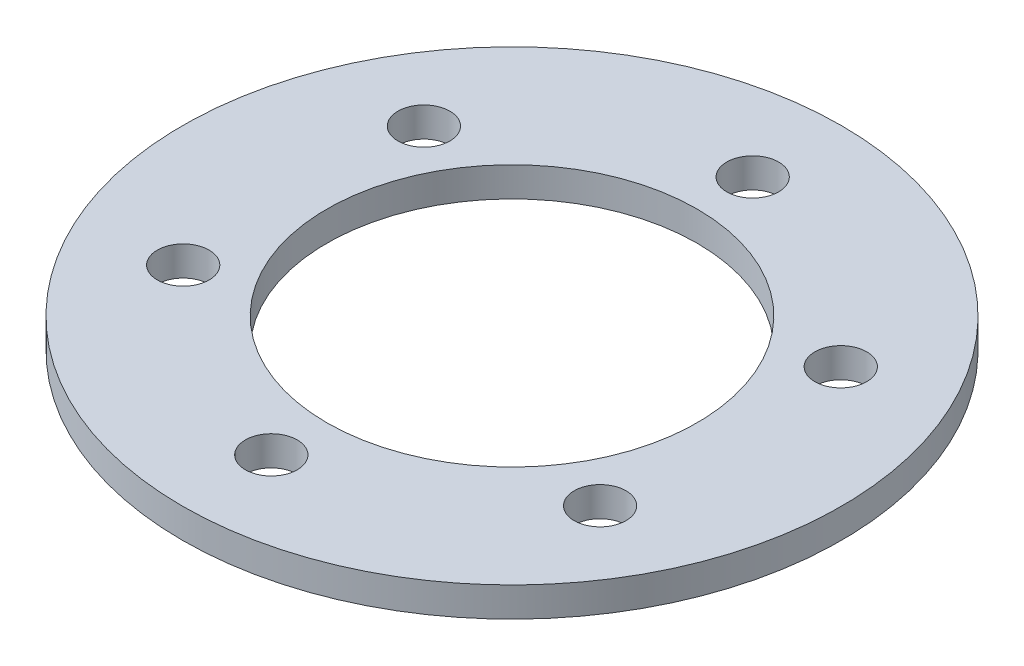
ISO-10303-21;
HEADER;
FILE_DESCRIPTION(('STEP AP214'),'2;1');
FILE_NAME('part.step','',(''),(''),'','','');
FILE_SCHEMA(('AUTOMOTIVE_DESIGN { 1 0 10303 214 1 1 1 1 }'));
ENDSEC;
DATA;
#1=APPLICATION_CONTEXT('core data for automotive mechanical design processes');
#2=APPLICATION_PROTOCOL_DEFINITION('international standard','automotive_design',2000,#1);
#3=PRODUCT_CONTEXT('',#1,'mechanical');
#4=PRODUCT('Part','Part','',(#3));
#5=PRODUCT_RELATED_PRODUCT_CATEGORY('part','',(#4));
#6=PRODUCT_DEFINITION_FORMATION('','',#4);
#7=PRODUCT_DEFINITION_CONTEXT('part definition',#1,'design');
#8=PRODUCT_DEFINITION('design','',#6,#7);
#9=PRODUCT_DEFINITION_SHAPE('','',#8);
#10=(LENGTH_UNIT() NAMED_UNIT(*) SI_UNIT(.MILLI.,.METRE.));
#11=(NAMED_UNIT(*) PLANE_ANGLE_UNIT() SI_UNIT($,.RADIAN.));
#12=(NAMED_UNIT(*) SI_UNIT($,.STERADIAN.) SOLID_ANGLE_UNIT());
#13=UNCERTAINTY_MEASURE_WITH_UNIT(LENGTH_MEASURE(1.E-05),#10,'distance_accuracy_value','');
#14=(GEOMETRIC_REPRESENTATION_CONTEXT(3) GLOBAL_UNCERTAINTY_ASSIGNED_CONTEXT((#13)) GLOBAL_UNIT_ASSIGNED_CONTEXT((#10,
#11,#12)) REPRESENTATION_CONTEXT('',''));
#15=CARTESIAN_POINT('',(0.,0.,0.));
#16=DIRECTION('',(0.,0.,1.));
#17=DIRECTION('',(1.,0.,0.));
#18=AXIS2_PLACEMENT_3D('',#15,#16,#17);
#19=CARTESIAN_POINT('',(0.,2.,0.));
#20=DIRECTION('',(0.,1.,0.));
#21=DIRECTION('',(0.,0.,1.));
#22=AXIS2_PLACEMENT_3D('',#19,#20,#21);
#23=PLANE('',#22);
#24=CARTESIAN_POINT('',(-14.0729128114971,2.,8.12500000000001));
#25=DIRECTION('',(0.,1.,0.));
#26=DIRECTION('',(0.,0.,1.));
#27=AXIS2_PLACEMENT_3D('',#24,#25,#26);
#28=CIRCLE('',#27,1.75);
#29=CARTESIAN_POINT('',(-14.0729128114971,2.,9.87500000000001));
#30=VERTEX_POINT('',#29);
#31=EDGE_CURVE('E92',#30,#30,#28,.T.);
#32=ORIENTED_EDGE('',*,*,#31,.F.);
#33=EDGE_LOOP('',(#32));
#34=FACE_BOUND('',#33,.T.);
#35=CARTESIAN_POINT('',(14.0729128114971,2.,8.125));
#36=DIRECTION('',(0.,1.,0.));
#37=DIRECTION('',(0.,0.,1.));
#38=AXIS2_PLACEMENT_3D('',#35,#36,#37);
#39=CIRCLE('',#38,1.75);
#40=CARTESIAN_POINT('',(14.0729128114971,2.,9.87499999999999));
#41=VERTEX_POINT('',#40);
#42=EDGE_CURVE('E76',#41,#41,#39,.T.);
#43=ORIENTED_EDGE('',*,*,#42,.F.);
#44=EDGE_LOOP('',(#43));
#45=FACE_BOUND('',#44,.T.);
#46=CARTESIAN_POINT('',(0.,2.,-16.25));
#47=DIRECTION('',(0.,1.,0.));
#48=DIRECTION('',(0.,0.,1.));
#49=AXIS2_PLACEMENT_3D('',#46,#47,#48);
#50=CIRCLE('',#49,1.75);
#51=CARTESIAN_POINT('',(0.,2.,-14.5));
#52=VERTEX_POINT('',#51);
#53=EDGE_CURVE('E62',#52,#52,#50,.T.);
#54=ORIENTED_EDGE('',*,*,#53,.F.);
#55=EDGE_LOOP('',(#54));
#56=FACE_BOUND('',#55,.T.);
#57=CARTESIAN_POINT('',(0.,2.,0.));
#58=DIRECTION('',(0.,1.,0.));
#59=DIRECTION('',(0.,0.,1.));
#60=AXIS2_PLACEMENT_3D('',#57,#58,#59);
#61=CIRCLE('',#60,22.25);
#62=CARTESIAN_POINT('',(0.,2.,22.25));
#63=VERTEX_POINT('',#62);
#64=EDGE_CURVE('E10',#63,#63,#61,.T.);
#65=ORIENTED_EDGE('',*,*,#64,.T.);
#66=EDGE_LOOP('',(#65));
#67=FACE_BOUND('',#66,.T.);
#68=CARTESIAN_POINT('',(0.,2.,0.));
#69=DIRECTION('',(0.,1.,0.));
#70=DIRECTION('',(0.,0.,1.));
#71=AXIS2_PLACEMENT_3D('',#68,#69,#70);
#72=CIRCLE('',#71,12.5);
#73=CARTESIAN_POINT('',(0.,2.,12.5));
#74=VERTEX_POINT('',#73);
#75=EDGE_CURVE('E57',#74,#74,#72,.T.);
#76=ORIENTED_EDGE('',*,*,#75,.F.);
#77=EDGE_LOOP('',(#76));
#78=FACE_BOUND('',#77,.T.);
#79=CARTESIAN_POINT('',(14.0729128114971,2.,-8.12500000000001));
#80=DIRECTION('',(0.,1.,0.));
#81=DIRECTION('',(0.,0.,1.));
#82=AXIS2_PLACEMENT_3D('',#79,#80,#81);
#83=CIRCLE('',#82,1.75);
#84=CARTESIAN_POINT('',(14.0729128114971,2.,-6.37500000000001));
#85=VERTEX_POINT('',#84);
#86=EDGE_CURVE('E68',#85,#85,#83,.T.);
#87=ORIENTED_EDGE('',*,*,#86,.F.);
#88=EDGE_LOOP('',(#87));
#89=FACE_BOUND('',#88,.T.);
#90=CARTESIAN_POINT('',(0.,2.,16.25));
#91=DIRECTION('',(0.,1.,0.));
#92=DIRECTION('',(0.,0.,1.));
#93=AXIS2_PLACEMENT_3D('',#90,#91,#92);
#94=CIRCLE('',#93,1.75);
#95=CARTESIAN_POINT('',(0.,2.,18.));
#96=VERTEX_POINT('',#95);
#97=EDGE_CURVE('E86',#96,#96,#94,.T.);
#98=ORIENTED_EDGE('',*,*,#97,.F.);
#99=EDGE_LOOP('',(#98));
#100=FACE_BOUND('',#99,.T.);
#101=CARTESIAN_POINT('',(-14.0729128114971,2.,-8.12499999999999));
#102=DIRECTION('',(0.,1.,0.));
#103=DIRECTION('',(0.,0.,1.));
#104=AXIS2_PLACEMENT_3D('',#101,#102,#103);
#105=CIRCLE('',#104,1.75);
#106=CARTESIAN_POINT('',(-14.0729128114971,2.,-6.37499999999999));
#107=VERTEX_POINT('',#106);
#108=EDGE_CURVE('E105',#107,#107,#105,.T.);
#109=ORIENTED_EDGE('',*,*,#108,.F.);
#110=EDGE_LOOP('',(#109));
#111=FACE_BOUND('',#110,.T.);
#112=ADVANCED_FACE('F43',(#34,#45,#56,#67,#78,#89,#100,#111),#23,.T.);
#113=CARTESIAN_POINT('',(0.,0.,0.));
#114=DIRECTION('',(0.,1.,0.));
#115=DIRECTION('',(0.,0.,1.));
#116=AXIS2_PLACEMENT_3D('',#113,#114,#115);
#117=PLANE('',#116);
#118=CARTESIAN_POINT('',(0.,0.,0.));
#119=DIRECTION('',(0.,1.,0.));
#120=DIRECTION('',(0.,0.,1.));
#121=AXIS2_PLACEMENT_3D('',#118,#119,#120);
#122=CIRCLE('',#121,22.25);
#123=CARTESIAN_POINT('',(0.,0.,22.25));
#124=VERTEX_POINT('',#123);
#125=EDGE_CURVE('E50',#124,#124,#122,.T.);
#126=ORIENTED_EDGE('',*,*,#125,.F.);
#127=EDGE_LOOP('',(#126));
#128=FACE_BOUND('',#127,.T.);
#129=CARTESIAN_POINT('',(0.,0.,0.));
#130=DIRECTION('',(0.,1.,0.));
#131=DIRECTION('',(0.,0.,1.));
#132=AXIS2_PLACEMENT_3D('',#129,#130,#131);
#133=CIRCLE('',#132,12.5);
#134=CARTESIAN_POINT('',(0.,0.,12.5));
#135=VERTEX_POINT('',#134);
#136=EDGE_CURVE('E59',#135,#135,#133,.T.);
#137=ORIENTED_EDGE('',*,*,#136,.T.);
#138=EDGE_LOOP('',(#137));
#139=FACE_BOUND('',#138,.T.);
#140=CARTESIAN_POINT('',(0.,0.,-16.25));
#141=DIRECTION('',(0.,1.,0.));
#142=DIRECTION('',(0.,0.,1.));
#143=AXIS2_PLACEMENT_3D('',#140,#141,#142);
#144=CIRCLE('',#143,1.75);
#145=CARTESIAN_POINT('',(0.,0.,-14.5));
#146=VERTEX_POINT('',#145);
#147=EDGE_CURVE('E67',#146,#146,#144,.T.);
#148=ORIENTED_EDGE('',*,*,#147,.T.);
#149=EDGE_LOOP('',(#148));
#150=FACE_BOUND('',#149,.T.);
#151=CARTESIAN_POINT('',(14.0729128114971,0.,-8.12500000000001));
#152=DIRECTION('',(0.,1.,0.));
#153=DIRECTION('',(0.,0.,1.));
#154=AXIS2_PLACEMENT_3D('',#151,#152,#153);
#155=CIRCLE('',#154,1.75);
#156=CARTESIAN_POINT('',(14.0729128114971,0.,-6.37500000000001));
#157=VERTEX_POINT('',#156);
#158=EDGE_CURVE('E73',#157,#157,#155,.T.);
#159=ORIENTED_EDGE('',*,*,#158,.T.);
#160=EDGE_LOOP('',(#159));
#161=FACE_BOUND('',#160,.T.);
#162=CARTESIAN_POINT('',(14.0729128114971,0.,8.125));
#163=DIRECTION('',(0.,1.,0.));
#164=DIRECTION('',(0.,0.,1.));
#165=AXIS2_PLACEMENT_3D('',#162,#163,#164);
#166=CIRCLE('',#165,1.75);
#167=CARTESIAN_POINT('',(14.0729128114971,0.,9.87499999999999));
#168=VERTEX_POINT('',#167);
#169=EDGE_CURVE('E85',#168,#168,#166,.T.);
#170=ORIENTED_EDGE('',*,*,#169,.T.);
#171=EDGE_LOOP('',(#170));
#172=FACE_BOUND('',#171,.T.);
#173=CARTESIAN_POINT('',(0.,0.,16.25));
#174=DIRECTION('',(0.,1.,0.));
#175=DIRECTION('',(0.,0.,1.));
#176=AXIS2_PLACEMENT_3D('',#173,#174,#175);
#177=CIRCLE('',#176,1.75);
#178=CARTESIAN_POINT('',(0.,0.,18.));
#179=VERTEX_POINT('',#178);
#180=EDGE_CURVE('E89',#179,#179,#177,.T.);
#181=ORIENTED_EDGE('',*,*,#180,.T.);
#182=EDGE_LOOP('',(#181));
#183=FACE_BOUND('',#182,.T.);
#184=CARTESIAN_POINT('',(-14.0729128114971,0.,8.12500000000001));
#185=DIRECTION('',(0.,1.,0.));
#186=DIRECTION('',(0.,0.,1.));
#187=AXIS2_PLACEMENT_3D('',#184,#185,#186);
#188=CIRCLE('',#187,1.75);
#189=CARTESIAN_POINT('',(-14.0729128114971,0.,9.87500000000001));
#190=VERTEX_POINT('',#189);
#191=EDGE_CURVE('E97',#190,#190,#188,.T.);
#192=ORIENTED_EDGE('',*,*,#191,.T.);
#193=EDGE_LOOP('',(#192));
#194=FACE_BOUND('',#193,.T.);
#195=CARTESIAN_POINT('',(-14.0729128114971,0.,-8.12499999999999));
#196=DIRECTION('',(0.,1.,0.));
#197=DIRECTION('',(0.,0.,1.));
#198=AXIS2_PLACEMENT_3D('',#195,#196,#197);
#199=CIRCLE('',#198,1.75);
#200=CARTESIAN_POINT('',(-14.0729128114971,0.,-6.37499999999999));
#201=VERTEX_POINT('',#200);
#202=EDGE_CURVE('E106',#201,#201,#199,.T.);
#203=ORIENTED_EDGE('',*,*,#202,.T.);
#204=EDGE_LOOP('',(#203));
#205=FACE_BOUND('',#204,.T.);
#206=ADVANCED_FACE('F119',(#128,#139,#150,#161,#172,#183,#194,#205),#117,.F.);
#207=CARTESIAN_POINT('',(0.,2.,0.));
#208=DIRECTION('',(0.,-1.,0.));
#209=DIRECTION('',(0.,0.,-1.));
#210=AXIS2_PLACEMENT_3D('',#207,#208,#209);
#211=CYLINDRICAL_SURFACE('',#210,22.25);
#212=ORIENTED_EDGE('',*,*,#64,.F.);
#213=EDGE_LOOP('',(#212));
#214=FACE_BOUND('',#213,.T.);
#215=ORIENTED_EDGE('',*,*,#125,.T.);
#216=EDGE_LOOP('',(#215));
#217=FACE_BOUND('',#216,.T.);
#218=ADVANCED_FACE('F44',(#214,#217),#211,.T.);
#219=CARTESIAN_POINT('',(0.,2.,0.));
#220=DIRECTION('',(0.,-1.,0.));
#221=DIRECTION('',(0.,0.,-1.));
#222=AXIS2_PLACEMENT_3D('',#219,#220,#221);
#223=CYLINDRICAL_SURFACE('',#222,12.5);
#224=ORIENTED_EDGE('',*,*,#75,.T.);
#225=EDGE_LOOP('',(#224));
#226=FACE_BOUND('',#225,.T.);
#227=ORIENTED_EDGE('',*,*,#136,.F.);
#228=EDGE_LOOP('',(#227));
#229=FACE_BOUND('',#228,.T.);
#230=ADVANCED_FACE('F126',(#226,#229),#223,.F.);
#231=CARTESIAN_POINT('',(0.,2.,-16.25));
#232=DIRECTION('',(0.,-1.,0.));
#233=DIRECTION('',(0.,0.,-1.));
#234=AXIS2_PLACEMENT_3D('',#231,#232,#233);
#235=CYLINDRICAL_SURFACE('',#234,1.75);
#236=ORIENTED_EDGE('',*,*,#53,.T.);
#237=EDGE_LOOP('',(#236));
#238=FACE_BOUND('',#237,.T.);
#239=ORIENTED_EDGE('',*,*,#147,.F.);
#240=EDGE_LOOP('',(#239));
#241=FACE_BOUND('',#240,.T.);
#242=ADVANCED_FACE('F131',(#238,#241),#235,.F.);
#243=CARTESIAN_POINT('',(14.0729128114971,2.,-8.12500000000001));
#244=DIRECTION('',(0.,-1.,0.));
#245=DIRECTION('',(0.,0.,-1.));
#246=AXIS2_PLACEMENT_3D('',#243,#244,#245);
#247=CYLINDRICAL_SURFACE('',#246,1.75);
#248=ORIENTED_EDGE('',*,*,#86,.T.);
#249=EDGE_LOOP('',(#248));
#250=FACE_BOUND('',#249,.T.);
#251=ORIENTED_EDGE('',*,*,#158,.F.);
#252=EDGE_LOOP('',(#251));
#253=FACE_BOUND('',#252,.T.);
#254=ADVANCED_FACE('F134',(#250,#253),#247,.F.);
#255=CARTESIAN_POINT('',(14.0729128114971,2.,8.125));
#256=DIRECTION('',(0.,-1.,0.));
#257=DIRECTION('',(0.,0.,-1.));
#258=AXIS2_PLACEMENT_3D('',#255,#256,#257);
#259=CYLINDRICAL_SURFACE('',#258,1.75);
#260=ORIENTED_EDGE('',*,*,#42,.T.);
#261=EDGE_LOOP('',(#260));
#262=FACE_BOUND('',#261,.T.);
#263=ORIENTED_EDGE('',*,*,#169,.F.);
#264=EDGE_LOOP('',(#263));
#265=FACE_BOUND('',#264,.T.);
#266=ADVANCED_FACE('F137',(#262,#265),#259,.F.);
#267=CARTESIAN_POINT('',(0.,2.,16.25));
#268=DIRECTION('',(0.,-1.,0.));
#269=DIRECTION('',(0.,0.,-1.));
#270=AXIS2_PLACEMENT_3D('',#267,#268,#269);
#271=CYLINDRICAL_SURFACE('',#270,1.75);
#272=ORIENTED_EDGE('',*,*,#97,.T.);
#273=EDGE_LOOP('',(#272));
#274=FACE_BOUND('',#273,.T.);
#275=ORIENTED_EDGE('',*,*,#180,.F.);
#276=EDGE_LOOP('',(#275));
#277=FACE_BOUND('',#276,.T.);
#278=ADVANCED_FACE('F142',(#274,#277),#271,.F.);
#279=CARTESIAN_POINT('',(-14.0729128114971,2.,8.12500000000001));
#280=DIRECTION('',(0.,-1.,0.));
#281=DIRECTION('',(0.,0.,-1.));
#282=AXIS2_PLACEMENT_3D('',#279,#280,#281);
#283=CYLINDRICAL_SURFACE('',#282,1.75);
#284=ORIENTED_EDGE('',*,*,#31,.T.);
#285=EDGE_LOOP('',(#284));
#286=FACE_BOUND('',#285,.T.);
#287=ORIENTED_EDGE('',*,*,#191,.F.);
#288=EDGE_LOOP('',(#287));
#289=FACE_BOUND('',#288,.T.);
#290=ADVANCED_FACE('F150',(#286,#289),#283,.F.);
#291=CARTESIAN_POINT('',(-14.0729128114971,2.,-8.12499999999999));
#292=DIRECTION('',(0.,-1.,0.));
#293=DIRECTION('',(0.,0.,-1.));
#294=AXIS2_PLACEMENT_3D('',#291,#292,#293);
#295=CYLINDRICAL_SURFACE('',#294,1.75);
#296=ORIENTED_EDGE('',*,*,#108,.T.);
#297=EDGE_LOOP('',(#296));
#298=FACE_BOUND('',#297,.T.);
#299=ORIENTED_EDGE('',*,*,#202,.F.);
#300=EDGE_LOOP('',(#299));
#301=FACE_BOUND('',#300,.T.);
#302=ADVANCED_FACE('F114',(#298,#301),#295,.F.);
#303=CLOSED_SHELL('',(#112,#206,#218,#230,#242,#254,#266,#278,#290,#302));
#304=MANIFOLD_SOLID_BREP('B2',#303);
#305=ADVANCED_BREP_SHAPE_REPRESENTATION('',(#18,#304),#14);
#306=SHAPE_DEFINITION_REPRESENTATION(#9,#305);
ENDSEC;
END-ISO-10303-21;
